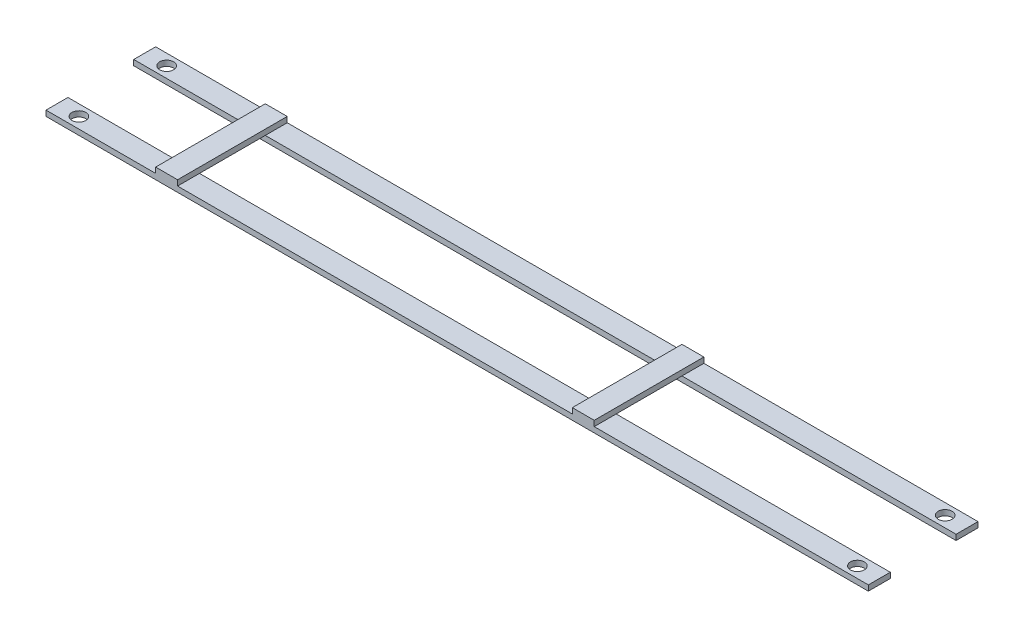
ISO-10303-21;
HEADER;
FILE_DESCRIPTION(('STEP AP214'),'2;1');
FILE_NAME('part.step','',(''),(''),'','','');
FILE_SCHEMA(('AUTOMOTIVE_DESIGN { 1 0 10303 214 1 1 1 1 }'));
ENDSEC;
DATA;
#1=APPLICATION_CONTEXT('core data for automotive mechanical design processes');
#2=APPLICATION_PROTOCOL_DEFINITION('international standard','automotive_design',2000,#1);
#3=PRODUCT_CONTEXT('',#1,'mechanical');
#4=PRODUCT('Part','Part','',(#3));
#5=PRODUCT_RELATED_PRODUCT_CATEGORY('part','',(#4));
#6=PRODUCT_DEFINITION_FORMATION('','',#4);
#7=PRODUCT_DEFINITION_CONTEXT('part definition',#1,'design');
#8=PRODUCT_DEFINITION('design','',#6,#7);
#9=PRODUCT_DEFINITION_SHAPE('','',#8);
#10=(LENGTH_UNIT() NAMED_UNIT(*) SI_UNIT(.MILLI.,.METRE.));
#11=(NAMED_UNIT(*) PLANE_ANGLE_UNIT() SI_UNIT($,.RADIAN.));
#12=(NAMED_UNIT(*) SI_UNIT($,.STERADIAN.) SOLID_ANGLE_UNIT());
#13=UNCERTAINTY_MEASURE_WITH_UNIT(LENGTH_MEASURE(1.E-05),#10,'distance_accuracy_value','');
#14=(GEOMETRIC_REPRESENTATION_CONTEXT(3) GLOBAL_UNCERTAINTY_ASSIGNED_CONTEXT((#13)) GLOBAL_UNIT_ASSIGNED_CONTEXT((#10,
#11,#12)) REPRESENTATION_CONTEXT('',''));
#15=CARTESIAN_POINT('',(0.,0.,0.));
#16=DIRECTION('',(0.,0.,1.));
#17=DIRECTION('',(1.,0.,0.));
#18=AXIS2_PLACEMENT_3D('',#15,#16,#17);
#19=CARTESIAN_POINT('',(0.,10.,0.));
#20=DIRECTION('',(0.,1.,0.));
#21=DIRECTION('',(0.,0.,1.));
#22=AXIS2_PLACEMENT_3D('',#19,#20,#21);
#23=PLANE('',#22);
#24=DIRECTION('',(-1.,0.,0.));
#25=VECTOR('',#24,1.);
#26=CARTESIAN_POINT('',(0.,10.,-120.));
#27=LINE('',#26,#25);
#28=CARTESIAN_POINT('',(240.,10.,-120.));
#29=VERTEX_POINT('',#28);
#30=CARTESIAN_POINT('',(200.,10.,-120.));
#31=VERTEX_POINT('',#30);
#32=EDGE_CURVE('E57',#29,#31,#27,.T.);
#33=ORIENTED_EDGE('',*,*,#32,.F.);
#34=DIRECTION('',(0.,0.,-1.));
#35=VECTOR('',#34,1.);
#36=CARTESIAN_POINT('',(240.,10.,40.));
#37=LINE('',#36,#35);
#38=CARTESIAN_POINT('',(240.,10.,0.));
#39=VERTEX_POINT('',#38);
#40=EDGE_CURVE('E289',#39,#29,#37,.T.);
#41=ORIENTED_EDGE('',*,*,#40,.F.);
#42=DIRECTION('',(-1.,0.,0.));
#43=VECTOR('',#42,1.);
#44=CARTESIAN_POINT('',(0.,10.,0.));
#45=LINE('',#44,#43);
#46=CARTESIAN_POINT('',(200.,10.,0.));
#47=VERTEX_POINT('',#46);
#48=EDGE_CURVE('E193',#39,#47,#45,.T.);
#49=ORIENTED_EDGE('',*,*,#48,.T.);
#50=DIRECTION('',(0.,0.,1.));
#51=VECTOR('',#50,1.);
#52=CARTESIAN_POINT('',(200.,10.,40.));
#53=LINE('',#52,#51);
#54=EDGE_CURVE('E50',#31,#47,#53,.T.);
#55=ORIENTED_EDGE('',*,*,#54,.F.);
#56=EDGE_LOOP('',(#33,#41,#49,#55));
#57=FACE_BOUND('',#56,.T.);
#58=ADVANCED_FACE('F39',(#57),#23,.F.);
#59=CARTESIAN_POINT('',(0.,10.,0.));
#60=DIRECTION('',(0.,1.,0.));
#61=DIRECTION('',(0.,0.,1.));
#62=AXIS2_PLACEMENT_3D('',#59,#60,#61);
#63=PLANE('',#62);
#64=CARTESIAN_POINT('',(1000.,10.,-120.));
#65=VERTEX_POINT('',#64);
#66=CARTESIAN_POINT('',(960.,10.,-120.));
#67=VERTEX_POINT('',#66);
#68=EDGE_CURVE('E63',#65,#67,#27,.T.);
#69=ORIENTED_EDGE('',*,*,#68,.F.);
#70=DIRECTION('',(0.,0.,-1.));
#71=VECTOR('',#70,1.);
#72=CARTESIAN_POINT('',(1000.,10.,40.));
#73=LINE('',#72,#71);
#74=CARTESIAN_POINT('',(1000.,10.,0.));
#75=VERTEX_POINT('',#74);
#76=EDGE_CURVE('E259',#75,#65,#73,.T.);
#77=ORIENTED_EDGE('',*,*,#76,.F.);
#78=CARTESIAN_POINT('',(960.,10.,0.));
#79=VERTEX_POINT('',#78);
#80=EDGE_CURVE('E186',#75,#79,#45,.T.);
#81=ORIENTED_EDGE('',*,*,#80,.T.);
#82=DIRECTION('',(0.,0.,1.));
#83=VECTOR('',#82,1.);
#84=CARTESIAN_POINT('',(960.,10.,40.));
#85=LINE('',#84,#83);
#86=EDGE_CURVE('E277',#67,#79,#85,.T.);
#87=ORIENTED_EDGE('',*,*,#86,.F.);
#88=EDGE_LOOP('',(#69,#77,#81,#87));
#89=FACE_BOUND('',#88,.T.);
#90=ADVANCED_FACE('F362',(#89),#63,.F.);
#91=CARTESIAN_POINT('',(0.,10.,0.));
#92=DIRECTION('',(0.,1.,0.));
#93=DIRECTION('',(0.,0.,1.));
#94=AXIS2_PLACEMENT_3D('',#91,#92,#93);
#95=PLANE('',#94);
#96=CARTESIAN_POINT('',(1460.,10.,20.));
#97=DIRECTION('',(0.,-1.,0.));
#98=DIRECTION('',(0.,0.,-1.));
#99=AXIS2_PLACEMENT_3D('',#96,#97,#98);
#100=CIRCLE('',#99,12.6999999999999);
#101=CARTESIAN_POINT('',(1460.,10.,7.30000000000012));
#102=VERTEX_POINT('',#101);
#103=EDGE_CURVE('E208',#102,#102,#100,.T.);
#104=ORIENTED_EDGE('',*,*,#103,.T.);
#105=EDGE_LOOP('',(#104));
#106=FACE_BOUND('',#105,.T.);
#107=CARTESIAN_POINT('',(1500.,10.,0.));
#108=VERTEX_POINT('',#107);
#109=EDGE_CURVE('E180',#108,#75,#45,.T.);
#110=ORIENTED_EDGE('',*,*,#109,.T.);
#111=CARTESIAN_POINT('',(1000.,10.,40.));
#112=VERTEX_POINT('',#111);
#113=EDGE_CURVE('E271',#112,#75,#73,.T.);
#114=ORIENTED_EDGE('',*,*,#113,.F.);
#115=DIRECTION('',(1.,0.,0.));
#116=VECTOR('',#115,1.);
#117=CARTESIAN_POINT('',(0.,10.,40.));
#118=LINE('',#117,#116);
#119=CARTESIAN_POINT('',(1500.,10.,40.));
#120=VERTEX_POINT('',#119);
#121=EDGE_CURVE('E206',#112,#120,#118,.T.);
#122=ORIENTED_EDGE('',*,*,#121,.T.);
#123=DIRECTION('',(0.,0.,1.));
#124=VECTOR('',#123,1.);
#125=CARTESIAN_POINT('',(1500.,10.,0.));
#126=LINE('',#125,#124);
#127=EDGE_CURVE('E199',#108,#120,#126,.T.);
#128=ORIENTED_EDGE('',*,*,#127,.F.);
#129=EDGE_LOOP('',(#110,#114,#122,#128));
#130=FACE_BOUND('',#129,.T.);
#131=ADVANCED_FACE('F204',(#106,#130),#95,.T.);
#132=CARTESIAN_POINT('',(240.,10.,40.));
#133=VERTEX_POINT('',#132);
#134=CARTESIAN_POINT('',(960.,10.,40.));
#135=VERTEX_POINT('',#134);
#136=EDGE_CURVE('E322',#133,#135,#118,.T.);
#137=ORIENTED_EDGE('',*,*,#136,.T.);
#138=EDGE_CURVE('E274',#79,#135,#85,.T.);
#139=ORIENTED_EDGE('',*,*,#138,.F.);
#140=EDGE_CURVE('E192',#79,#39,#45,.T.);
#141=ORIENTED_EDGE('',*,*,#140,.T.);
#142=EDGE_CURVE('E300',#133,#39,#37,.T.);
#143=ORIENTED_EDGE('',*,*,#142,.F.);
#144=EDGE_LOOP('',(#137,#139,#141,#143));
#145=FACE_BOUND('',#144,.T.);
#146=ADVANCED_FACE('F359',(#145),#95,.T.);
#147=CARTESIAN_POINT('',(0.,10.,0.));
#148=DIRECTION('',(1.,0.,0.));
#149=DIRECTION('',(0.,0.,-1.));
#150=AXIS2_PLACEMENT_3D('',#147,#148,#149);
#151=PLANE('',#150);
#152=DIRECTION('',(0.,0.,1.));
#153=VECTOR('',#152,1.);
#154=CARTESIAN_POINT('',(0.,0.,0.));
#155=LINE('',#154,#153);
#156=CARTESIAN_POINT('',(0.,0.,0.));
#157=VERTEX_POINT('',#156);
#158=CARTESIAN_POINT('',(0.,0.,40.));
#159=VERTEX_POINT('',#158);
#160=EDGE_CURVE('E315',#157,#159,#155,.T.);
#161=ORIENTED_EDGE('',*,*,#160,.T.);
#162=DIRECTION('',(0.,-1.,0.));
#163=VECTOR('',#162,1.);
#164=CARTESIAN_POINT('',(0.,10.,40.));
#165=LINE('',#164,#163);
#166=CARTESIAN_POINT('',(0.,10.,40.));
#167=VERTEX_POINT('',#166);
#168=EDGE_CURVE('E43',#167,#159,#165,.T.);
#169=ORIENTED_EDGE('',*,*,#168,.F.);
#170=DIRECTION('',(0.,0.,1.));
#171=VECTOR('',#170,1.);
#172=CARTESIAN_POINT('',(0.,10.,0.));
#173=LINE('',#172,#171);
#174=CARTESIAN_POINT('',(0.,10.,0.));
#175=VERTEX_POINT('',#174);
#176=EDGE_CURVE('E316',#175,#167,#173,.T.);
#177=ORIENTED_EDGE('',*,*,#176,.F.);
#178=DIRECTION('',(0.,-1.,0.));
#179=VECTOR('',#178,1.);
#180=CARTESIAN_POINT('',(0.,10.,0.));
#181=LINE('',#180,#179);
#182=EDGE_CURVE('E190',#175,#157,#181,.T.);
#183=ORIENTED_EDGE('',*,*,#182,.T.);
#184=EDGE_LOOP('',(#161,#169,#177,#183));
#185=FACE_BOUND('',#184,.T.);
#186=ADVANCED_FACE('F41',(#185),#151,.F.);
#187=CARTESIAN_POINT('',(0.,10.,40.));
#188=DIRECTION('',(0.,0.,-1.));
#189=DIRECTION('',(-1.,0.,0.));
#190=AXIS2_PLACEMENT_3D('',#187,#188,#189);
#191=PLANE('',#190);
#192=DIRECTION('',(1.,0.,0.));
#193=VECTOR('',#192,1.);
#194=CARTESIAN_POINT('',(0.,0.,40.));
#195=LINE('',#194,#193);
#196=CARTESIAN_POINT('',(1500.,0.,40.));
#197=VERTEX_POINT('',#196);
#198=EDGE_CURVE('E326',#159,#197,#195,.T.);
#199=ORIENTED_EDGE('',*,*,#198,.T.);
#200=DIRECTION('',(0.,1.,0.));
#201=VECTOR('',#200,1.);
#202=CARTESIAN_POINT('',(1500.,-302.654919008431,40.));
#203=LINE('',#202,#201);
#204=EDGE_CURVE('E202',#197,#120,#203,.T.);
#205=ORIENTED_EDGE('',*,*,#204,.T.);
#206=ORIENTED_EDGE('',*,*,#121,.F.);
#207=DIRECTION('',(0.,-1.,0.));
#208=VECTOR('',#207,1.);
#209=CARTESIAN_POINT('',(1000.,20.,40.));
#210=LINE('',#209,#208);
#211=CARTESIAN_POINT('',(1000.,20.,40.));
#212=VERTEX_POINT('',#211);
#213=EDGE_CURVE('E270',#212,#112,#210,.T.);
#214=ORIENTED_EDGE('',*,*,#213,.F.);
#215=DIRECTION('',(1.,0.,0.));
#216=VECTOR('',#215,1.);
#217=CARTESIAN_POINT('',(1000.,20.,40.));
#218=LINE('',#217,#216);
#219=CARTESIAN_POINT('',(960.,20.,40.));
#220=VERTEX_POINT('',#219);
#221=EDGE_CURVE('E268',#220,#212,#218,.T.);
#222=ORIENTED_EDGE('',*,*,#221,.F.);
#223=DIRECTION('',(0.,-1.,0.));
#224=VECTOR('',#223,1.);
#225=CARTESIAN_POINT('',(960.,20.,40.));
#226=LINE('',#225,#224);
#227=EDGE_CURVE('E280',#220,#135,#226,.T.);
#228=ORIENTED_EDGE('',*,*,#227,.T.);
#229=ORIENTED_EDGE('',*,*,#136,.F.);
#230=DIRECTION('',(0.,-1.,0.));
#231=VECTOR('',#230,1.);
#232=CARTESIAN_POINT('',(240.,20.,40.));
#233=LINE('',#232,#231);
#234=CARTESIAN_POINT('',(240.,20.,40.));
#235=VERTEX_POINT('',#234);
#236=EDGE_CURVE('E299',#235,#133,#233,.T.);
#237=ORIENTED_EDGE('',*,*,#236,.F.);
#238=DIRECTION('',(1.,0.,0.));
#239=VECTOR('',#238,1.);
#240=CARTESIAN_POINT('',(240.,20.,40.));
#241=LINE('',#240,#239);
#242=CARTESIAN_POINT('',(200.,20.,40.));
#243=VERTEX_POINT('',#242);
#244=EDGE_CURVE('E297',#243,#235,#241,.T.);
#245=ORIENTED_EDGE('',*,*,#244,.F.);
#246=DIRECTION('',(0.,-1.,0.));
#247=VECTOR('',#246,1.);
#248=CARTESIAN_POINT('',(200.,20.,40.));
#249=LINE('',#248,#247);
#250=CARTESIAN_POINT('',(200.,10.,40.));
#251=VERTEX_POINT('',#250);
#252=EDGE_CURVE('E306',#243,#251,#249,.T.);
#253=ORIENTED_EDGE('',*,*,#252,.T.);
#254=EDGE_CURVE('E320',#167,#251,#118,.T.);
#255=ORIENTED_EDGE('',*,*,#254,.F.);
#256=ORIENTED_EDGE('',*,*,#168,.T.);
#257=EDGE_LOOP('',(#199,#205,#206,#214,#222,#228,#229,#237,#245,#253,#255,#256));
#258=FACE_BOUND('',#257,.T.);
#259=ADVANCED_FACE('F336',(#258),#191,.F.);
#260=CARTESIAN_POINT('',(0.,10.,0.));
#261=DIRECTION('',(0.,0.,1.));
#262=DIRECTION('',(1.,0.,0.));
#263=AXIS2_PLACEMENT_3D('',#260,#261,#262);
#264=PLANE('',#263);
#265=DIRECTION('',(-1.,0.,0.));
#266=VECTOR('',#265,1.);
#267=CARTESIAN_POINT('',(0.,0.,0.));
#268=LINE('',#267,#266);
#269=CARTESIAN_POINT('',(1500.,0.,0.));
#270=VERTEX_POINT('',#269);
#271=EDGE_CURVE('E319',#270,#157,#268,.T.);
#272=ORIENTED_EDGE('',*,*,#271,.T.);
#273=ORIENTED_EDGE('',*,*,#182,.F.);
#274=EDGE_CURVE('E321',#47,#175,#45,.T.);
#275=ORIENTED_EDGE('',*,*,#274,.F.);
#276=ORIENTED_EDGE('',*,*,#48,.F.);
#277=ORIENTED_EDGE('',*,*,#140,.F.);
#278=ORIENTED_EDGE('',*,*,#80,.F.);
#279=ORIENTED_EDGE('',*,*,#109,.F.);
#280=DIRECTION('',(0.,1.,0.));
#281=VECTOR('',#280,1.);
#282=CARTESIAN_POINT('',(1500.,-302.654919008431,0.));
#283=LINE('',#282,#281);
#284=EDGE_CURVE('E183',#270,#108,#283,.T.);
#285=ORIENTED_EDGE('',*,*,#284,.F.);
#286=EDGE_LOOP('',(#272,#273,#275,#276,#277,#278,#279,#285));
#287=FACE_BOUND('',#286,.T.);
#288=ADVANCED_FACE('F182',(#287),#264,.F.);
#289=CARTESIAN_POINT('',(40.,10.,20.));
#290=DIRECTION('',(0.,-1.,0.));
#291=DIRECTION('',(0.,0.,-1.));
#292=AXIS2_PLACEMENT_3D('',#289,#290,#291);
#293=CIRCLE('',#292,12.7);
#294=CARTESIAN_POINT('',(40.,10.,7.3));
#295=VERTEX_POINT('',#294);
#296=EDGE_CURVE('E456',#295,#295,#293,.T.);
#297=ORIENTED_EDGE('',*,*,#296,.T.);
#298=EDGE_LOOP('',(#297));
#299=FACE_BOUND('',#298,.T.);
#300=EDGE_CURVE('E11',#47,#251,#53,.T.);
#301=ORIENTED_EDGE('',*,*,#300,.F.);
#302=ORIENTED_EDGE('',*,*,#274,.T.);
#303=ORIENTED_EDGE('',*,*,#176,.T.);
#304=ORIENTED_EDGE('',*,*,#254,.T.);
#305=EDGE_LOOP('',(#301,#302,#303,#304));
#306=FACE_BOUND('',#305,.T.);
#307=ADVANCED_FACE('F371',(#299,#306),#95,.T.);
#308=CARTESIAN_POINT('',(0.,0.,0.));
#309=DIRECTION('',(0.,1.,0.));
#310=DIRECTION('',(0.,0.,1.));
#311=AXIS2_PLACEMENT_3D('',#308,#309,#310);
#312=PLANE('',#311);
#313=CARTESIAN_POINT('',(40.,0.,20.));
#314=DIRECTION('',(0.,-1.,0.));
#315=DIRECTION('',(0.,0.,-1.));
#316=AXIS2_PLACEMENT_3D('',#313,#314,#315);
#317=CIRCLE('',#316,12.7);
#318=CARTESIAN_POINT('',(40.,0.,7.3));
#319=VERTEX_POINT('',#318);
#320=EDGE_CURVE('E458',#319,#319,#317,.T.);
#321=ORIENTED_EDGE('',*,*,#320,.F.);
#322=EDGE_LOOP('',(#321));
#323=FACE_BOUND('',#322,.T.);
#324=CARTESIAN_POINT('',(1460.,0.,20.));
#325=DIRECTION('',(0.,-1.,0.));
#326=DIRECTION('',(0.,0.,-1.));
#327=AXIS2_PLACEMENT_3D('',#324,#325,#326);
#328=CIRCLE('',#327,12.6999999999999);
#329=CARTESIAN_POINT('',(1460.,0.,7.30000000000012));
#330=VERTEX_POINT('',#329);
#331=EDGE_CURVE('E211',#330,#330,#328,.T.);
#332=ORIENTED_EDGE('',*,*,#331,.F.);
#333=EDGE_LOOP('',(#332));
#334=FACE_BOUND('',#333,.T.);
#335=ORIENTED_EDGE('',*,*,#160,.F.);
#336=ORIENTED_EDGE('',*,*,#271,.F.);
#337=DIRECTION('',(0.,0.,-1.));
#338=VECTOR('',#337,1.);
#339=CARTESIAN_POINT('',(1500.,0.,0.));
#340=LINE('',#339,#338);
#341=EDGE_CURVE('E201',#197,#270,#340,.T.);
#342=ORIENTED_EDGE('',*,*,#341,.F.);
#343=ORIENTED_EDGE('',*,*,#198,.F.);
#344=EDGE_LOOP('',(#335,#336,#342,#343));
#345=FACE_BOUND('',#344,.T.);
#346=ADVANCED_FACE('F338',(#323,#334,#345),#312,.F.);
#347=CARTESIAN_POINT('',(240.,20.,40.));
#348=DIRECTION('',(-1.,0.,0.));
#349=DIRECTION('',(0.,0.,1.));
#350=AXIS2_PLACEMENT_3D('',#347,#348,#349);
#351=PLANE('',#350);
#352=ORIENTED_EDGE('',*,*,#142,.T.);
#353=ORIENTED_EDGE('',*,*,#40,.T.);
#354=DIRECTION('',(0.,0.,-1.));
#355=VECTOR('',#354,1.);
#356=CARTESIAN_POINT('',(240.,10.,40.));
#357=LINE('',#356,#355);
#358=CARTESIAN_POINT('',(240.,10.,-160.));
#359=VERTEX_POINT('',#358);
#360=EDGE_CURVE('E256',#29,#359,#357,.T.);
#361=ORIENTED_EDGE('',*,*,#360,.T.);
#362=DIRECTION('',(0.,-1.,0.));
#363=VECTOR('',#362,1.);
#364=CARTESIAN_POINT('',(240.,20.,-160.));
#365=LINE('',#364,#363);
#366=CARTESIAN_POINT('',(240.,20.,-160.));
#367=VERTEX_POINT('',#366);
#368=EDGE_CURVE('E312',#367,#359,#365,.T.);
#369=ORIENTED_EDGE('',*,*,#368,.F.);
#370=DIRECTION('',(0.,0.,-1.));
#371=VECTOR('',#370,1.);
#372=CARTESIAN_POINT('',(240.,20.,40.));
#373=LINE('',#372,#371);
#374=EDGE_CURVE('E290',#235,#367,#373,.T.);
#375=ORIENTED_EDGE('',*,*,#374,.F.);
#376=ORIENTED_EDGE('',*,*,#236,.T.);
#377=EDGE_LOOP('',(#352,#353,#361,#369,#375,#376));
#378=FACE_BOUND('',#377,.T.);
#379=ADVANCED_FACE('F393',(#378),#351,.F.);
#380=CARTESIAN_POINT('',(240.,20.,-160.));
#381=DIRECTION('',(0.,0.,1.));
#382=DIRECTION('',(1.,0.,0.));
#383=AXIS2_PLACEMENT_3D('',#380,#381,#382);
#384=PLANE('',#383);
#385=ORIENTED_EDGE('',*,*,#368,.T.);
#386=DIRECTION('',(1.,0.,0.));
#387=VECTOR('',#386,1.);
#388=CARTESIAN_POINT('',(0.,10.,-160.));
#389=LINE('',#388,#387);
#390=CARTESIAN_POINT('',(960.,10.,-160.));
#391=VERTEX_POINT('',#390);
#392=EDGE_CURVE('E246',#359,#391,#389,.T.);
#393=ORIENTED_EDGE('',*,*,#392,.T.);
#394=DIRECTION('',(0.,-1.,0.));
#395=VECTOR('',#394,1.);
#396=CARTESIAN_POINT('',(960.,20.,-160.));
#397=LINE('',#396,#395);
#398=CARTESIAN_POINT('',(960.,20.,-160.));
#399=VERTEX_POINT('',#398);
#400=EDGE_CURVE('E283',#399,#391,#397,.T.);
#401=ORIENTED_EDGE('',*,*,#400,.F.);
#402=DIRECTION('',(-1.,0.,0.));
#403=VECTOR('',#402,1.);
#404=CARTESIAN_POINT('',(1000.,20.,-160.));
#405=LINE('',#404,#403);
#406=CARTESIAN_POINT('',(1000.,20.,-160.));
#407=VERTEX_POINT('',#406);
#408=EDGE_CURVE('E263',#407,#399,#405,.T.);
#409=ORIENTED_EDGE('',*,*,#408,.F.);
#410=DIRECTION('',(0.,-1.,0.));
#411=VECTOR('',#410,1.);
#412=CARTESIAN_POINT('',(1000.,20.,-160.));
#413=LINE('',#412,#411);
#414=CARTESIAN_POINT('',(1000.,10.,-160.));
#415=VERTEX_POINT('',#414);
#416=EDGE_CURVE('E286',#407,#415,#413,.T.);
#417=ORIENTED_EDGE('',*,*,#416,.T.);
#418=CARTESIAN_POINT('',(1500.,10.,-160.));
#419=VERTEX_POINT('',#418);
#420=EDGE_CURVE('E241',#415,#419,#389,.T.);
#421=ORIENTED_EDGE('',*,*,#420,.T.);
#422=DIRECTION('',(0.,1.,0.));
#423=VECTOR('',#422,1.);
#424=CARTESIAN_POINT('',(1500.,-302.654919008431,-160.));
#425=LINE('',#424,#423);
#426=CARTESIAN_POINT('',(1500.,0.,-160.));
#427=VERTEX_POINT('',#426);
#428=EDGE_CURVE('E225',#427,#419,#425,.T.);
#429=ORIENTED_EDGE('',*,*,#428,.F.);
#430=DIRECTION('',(1.,0.,0.));
#431=VECTOR('',#430,1.);
#432=CARTESIAN_POINT('',(0.,0.,-160.));
#433=LINE('',#432,#431);
#434=CARTESIAN_POINT('',(0.,0.,-160.));
#435=VERTEX_POINT('',#434);
#436=EDGE_CURVE('E233',#435,#427,#433,.T.);
#437=ORIENTED_EDGE('',*,*,#436,.F.);
#438=DIRECTION('',(0.,1.,0.));
#439=VECTOR('',#438,1.);
#440=CARTESIAN_POINT('',(0.,0.,-160.));
#441=LINE('',#440,#439);
#442=CARTESIAN_POINT('',(0.,10.,-160.));
#443=VERTEX_POINT('',#442);
#444=EDGE_CURVE('E250',#435,#443,#441,.T.);
#445=ORIENTED_EDGE('',*,*,#444,.T.);
#446=CARTESIAN_POINT('',(200.,10.,-160.));
#447=VERTEX_POINT('',#446);
#448=EDGE_CURVE('E242',#443,#447,#389,.T.);
#449=ORIENTED_EDGE('',*,*,#448,.T.);
#450=DIRECTION('',(0.,-1.,0.));
#451=VECTOR('',#450,1.);
#452=CARTESIAN_POINT('',(200.,20.,-160.));
#453=LINE('',#452,#451);
#454=CARTESIAN_POINT('',(200.,20.,-160.));
#455=VERTEX_POINT('',#454);
#456=EDGE_CURVE('E309',#455,#447,#453,.T.);
#457=ORIENTED_EDGE('',*,*,#456,.F.);
#458=DIRECTION('',(-1.,0.,0.));
#459=VECTOR('',#458,1.);
#460=CARTESIAN_POINT('',(240.,20.,-160.));
#461=LINE('',#460,#459);
#462=EDGE_CURVE('E293',#367,#455,#461,.T.);
#463=ORIENTED_EDGE('',*,*,#462,.F.);
#464=EDGE_LOOP('',(#385,#393,#401,#409,#417,#421,#429,#437,#445,#449,#457,#463));
#465=FACE_BOUND('',#464,.T.);
#466=ADVANCED_FACE('F383',(#465),#384,.F.);
#467=CARTESIAN_POINT('',(200.,20.,40.));
#468=DIRECTION('',(1.,0.,0.));
#469=DIRECTION('',(0.,0.,-1.));
#470=AXIS2_PLACEMENT_3D('',#467,#468,#469);
#471=PLANE('',#470);
#472=EDGE_CURVE('E49',#447,#31,#53,.T.);
#473=ORIENTED_EDGE('',*,*,#472,.T.);
#474=ORIENTED_EDGE('',*,*,#54,.T.);
#475=ORIENTED_EDGE('',*,*,#300,.T.);
#476=ORIENTED_EDGE('',*,*,#252,.F.);
#477=DIRECTION('',(0.,0.,1.));
#478=VECTOR('',#477,1.);
#479=CARTESIAN_POINT('',(200.,20.,40.));
#480=LINE('',#479,#478);
#481=EDGE_CURVE('E295',#455,#243,#480,.T.);
#482=ORIENTED_EDGE('',*,*,#481,.F.);
#483=ORIENTED_EDGE('',*,*,#456,.T.);
#484=EDGE_LOOP('',(#473,#474,#475,#476,#482,#483));
#485=FACE_BOUND('',#484,.T.);
#486=ADVANCED_FACE('F374',(#485),#471,.F.);
#487=CARTESIAN_POINT('',(0.,20.,0.));
#488=DIRECTION('',(0.,1.,0.));
#489=DIRECTION('',(0.,0.,1.));
#490=AXIS2_PLACEMENT_3D('',#487,#488,#489);
#491=PLANE('',#490);
#492=ORIENTED_EDGE('',*,*,#374,.T.);
#493=ORIENTED_EDGE('',*,*,#462,.T.);
#494=ORIENTED_EDGE('',*,*,#481,.T.);
#495=ORIENTED_EDGE('',*,*,#244,.T.);
#496=EDGE_LOOP('',(#492,#493,#494,#495));
#497=FACE_BOUND('',#496,.T.);
#498=ADVANCED_FACE('F379',(#497),#491,.T.);
#499=CARTESIAN_POINT('',(1000.,20.,40.));
#500=DIRECTION('',(-1.,0.,0.));
#501=DIRECTION('',(0.,0.,1.));
#502=AXIS2_PLACEMENT_3D('',#499,#500,#501);
#503=PLANE('',#502);
#504=ORIENTED_EDGE('',*,*,#113,.T.);
#505=ORIENTED_EDGE('',*,*,#76,.T.);
#506=DIRECTION('',(0.,0.,-1.));
#507=VECTOR('',#506,1.);
#508=CARTESIAN_POINT('',(1000.,10.,40.));
#509=LINE('',#508,#507);
#510=EDGE_CURVE('E253',#65,#415,#509,.T.);
#511=ORIENTED_EDGE('',*,*,#510,.T.);
#512=ORIENTED_EDGE('',*,*,#416,.F.);
#513=DIRECTION('',(0.,0.,-1.));
#514=VECTOR('',#513,1.);
#515=CARTESIAN_POINT('',(1000.,20.,40.));
#516=LINE('',#515,#514);
#517=EDGE_CURVE('E260',#212,#407,#516,.T.);
#518=ORIENTED_EDGE('',*,*,#517,.F.);
#519=ORIENTED_EDGE('',*,*,#213,.T.);
#520=EDGE_LOOP('',(#504,#505,#511,#512,#518,#519));
#521=FACE_BOUND('',#520,.T.);
#522=ADVANCED_FACE('F343',(#521),#503,.F.);
#523=CARTESIAN_POINT('',(960.,20.,40.));
#524=DIRECTION('',(1.,0.,0.));
#525=DIRECTION('',(0.,0.,-1.));
#526=AXIS2_PLACEMENT_3D('',#523,#524,#525);
#527=PLANE('',#526);
#528=EDGE_CURVE('E264',#391,#67,#85,.T.);
#529=ORIENTED_EDGE('',*,*,#528,.T.);
#530=ORIENTED_EDGE('',*,*,#86,.T.);
#531=ORIENTED_EDGE('',*,*,#138,.T.);
#532=ORIENTED_EDGE('',*,*,#227,.F.);
#533=DIRECTION('',(0.,0.,1.));
#534=VECTOR('',#533,1.);
#535=CARTESIAN_POINT('',(960.,20.,40.));
#536=LINE('',#535,#534);
#537=EDGE_CURVE('E266',#399,#220,#536,.T.);
#538=ORIENTED_EDGE('',*,*,#537,.F.);
#539=ORIENTED_EDGE('',*,*,#400,.T.);
#540=EDGE_LOOP('',(#529,#530,#531,#532,#538,#539));
#541=FACE_BOUND('',#540,.T.);
#542=ADVANCED_FACE('F355',(#541),#527,.F.);
#543=CARTESIAN_POINT('',(0.,20.,0.));
#544=DIRECTION('',(0.,1.,0.));
#545=DIRECTION('',(0.,0.,1.));
#546=AXIS2_PLACEMENT_3D('',#543,#544,#545);
#547=PLANE('',#546);
#548=ORIENTED_EDGE('',*,*,#517,.T.);
#549=ORIENTED_EDGE('',*,*,#408,.T.);
#550=ORIENTED_EDGE('',*,*,#537,.T.);
#551=ORIENTED_EDGE('',*,*,#221,.T.);
#552=EDGE_LOOP('',(#548,#549,#550,#551));
#553=FACE_BOUND('',#552,.T.);
#554=ADVANCED_FACE('F347',(#553),#547,.T.);
#555=CARTESIAN_POINT('',(0.,10.,0.));
#556=DIRECTION('',(0.,1.,0.));
#557=DIRECTION('',(0.,0.,1.));
#558=AXIS2_PLACEMENT_3D('',#555,#556,#557);
#559=PLANE('',#558);
#560=ORIENTED_EDGE('',*,*,#360,.F.);
#561=EDGE_CURVE('E389',#67,#29,#27,.T.);
#562=ORIENTED_EDGE('',*,*,#561,.F.);
#563=ORIENTED_EDGE('',*,*,#528,.F.);
#564=ORIENTED_EDGE('',*,*,#392,.F.);
#565=EDGE_LOOP('',(#560,#562,#563,#564));
#566=FACE_BOUND('',#565,.T.);
#567=ADVANCED_FACE('F395',(#566),#559,.T.);
#568=CARTESIAN_POINT('',(40.,10.,-140.));
#569=DIRECTION('',(0.,-1.,0.));
#570=DIRECTION('',(0.,0.,-1.));
#571=AXIS2_PLACEMENT_3D('',#568,#569,#570);
#572=CIRCLE('',#571,12.7);
#573=CARTESIAN_POINT('',(40.,10.,-152.7));
#574=VERTEX_POINT('',#573);
#575=EDGE_CURVE('E470',#574,#574,#572,.T.);
#576=ORIENTED_EDGE('',*,*,#575,.T.);
#577=EDGE_LOOP('',(#576));
#578=FACE_BOUND('',#577,.T.);
#579=ORIENTED_EDGE('',*,*,#472,.F.);
#580=ORIENTED_EDGE('',*,*,#448,.F.);
#581=DIRECTION('',(0.,0.,-1.));
#582=VECTOR('',#581,1.);
#583=CARTESIAN_POINT('',(0.,10.,-160.));
#584=LINE('',#583,#582);
#585=CARTESIAN_POINT('',(0.,10.,-120.));
#586=VERTEX_POINT('',#585);
#587=EDGE_CURVE('E220',#586,#443,#584,.T.);
#588=ORIENTED_EDGE('',*,*,#587,.F.);
#589=EDGE_CURVE('E245',#31,#586,#27,.T.);
#590=ORIENTED_EDGE('',*,*,#589,.F.);
#591=EDGE_LOOP('',(#579,#580,#588,#590));
#592=FACE_BOUND('',#591,.T.);
#593=ADVANCED_FACE('F387',(#578,#592),#559,.T.);
#594=CARTESIAN_POINT('',(1460.,10.,-140.));
#595=DIRECTION('',(0.,-1.,0.));
#596=DIRECTION('',(0.,0.,-1.));
#597=AXIS2_PLACEMENT_3D('',#594,#595,#596);
#598=CIRCLE('',#597,12.6999999999999);
#599=CARTESIAN_POINT('',(1460.,10.,-152.7));
#600=VERTEX_POINT('',#599);
#601=EDGE_CURVE('E464',#600,#600,#598,.T.);
#602=ORIENTED_EDGE('',*,*,#601,.T.);
#603=EDGE_LOOP('',(#602));
#604=FACE_BOUND('',#603,.T.);
#605=ORIENTED_EDGE('',*,*,#510,.F.);
#606=CARTESIAN_POINT('',(1500.,10.,-120.));
#607=VERTEX_POINT('',#606);
#608=EDGE_CURVE('E234',#607,#65,#27,.T.);
#609=ORIENTED_EDGE('',*,*,#608,.F.);
#610=DIRECTION('',(0.,0.,1.));
#611=VECTOR('',#610,1.);
#612=CARTESIAN_POINT('',(1500.,10.,0.));
#613=LINE('',#612,#611);
#614=EDGE_CURVE('E222',#419,#607,#613,.T.);
#615=ORIENTED_EDGE('',*,*,#614,.F.);
#616=ORIENTED_EDGE('',*,*,#420,.F.);
#617=EDGE_LOOP('',(#605,#609,#615,#616));
#618=FACE_BOUND('',#617,.T.);
#619=ADVANCED_FACE('F398',(#604,#618),#559,.T.);
#620=CARTESIAN_POINT('',(0.,0.,-160.));
#621=DIRECTION('',(1.,0.,0.));
#622=DIRECTION('',(0.,0.,-1.));
#623=AXIS2_PLACEMENT_3D('',#620,#621,#622);
#624=PLANE('',#623);
#625=ORIENTED_EDGE('',*,*,#587,.T.);
#626=ORIENTED_EDGE('',*,*,#444,.F.);
#627=DIRECTION('',(0.,0.,-1.));
#628=VECTOR('',#627,1.);
#629=CARTESIAN_POINT('',(0.,0.,-160.));
#630=LINE('',#629,#628);
#631=CARTESIAN_POINT('',(0.,0.,-120.));
#632=VERTEX_POINT('',#631);
#633=EDGE_CURVE('E230',#632,#435,#630,.T.);
#634=ORIENTED_EDGE('',*,*,#633,.F.);
#635=DIRECTION('',(0.,1.,0.));
#636=VECTOR('',#635,1.);
#637=CARTESIAN_POINT('',(0.,0.,-120.));
#638=LINE('',#637,#636);
#639=EDGE_CURVE('E238',#632,#586,#638,.T.);
#640=ORIENTED_EDGE('',*,*,#639,.T.);
#641=EDGE_LOOP('',(#625,#626,#634,#640));
#642=FACE_BOUND('',#641,.T.);
#643=ADVANCED_FACE('F408',(#642),#624,.F.);
#644=CARTESIAN_POINT('',(0.,0.,-120.));
#645=DIRECTION('',(0.,0.,-1.));
#646=DIRECTION('',(-1.,0.,0.));
#647=AXIS2_PLACEMENT_3D('',#644,#645,#646);
#648=PLANE('',#647);
#649=ORIENTED_EDGE('',*,*,#608,.T.);
#650=ORIENTED_EDGE('',*,*,#68,.T.);
#651=ORIENTED_EDGE('',*,*,#561,.T.);
#652=ORIENTED_EDGE('',*,*,#32,.T.);
#653=ORIENTED_EDGE('',*,*,#589,.T.);
#654=ORIENTED_EDGE('',*,*,#639,.F.);
#655=DIRECTION('',(-1.,0.,0.));
#656=VECTOR('',#655,1.);
#657=CARTESIAN_POINT('',(0.,0.,-120.));
#658=LINE('',#657,#656);
#659=CARTESIAN_POINT('',(1500.,0.,-120.));
#660=VERTEX_POINT('',#659);
#661=EDGE_CURVE('E236',#660,#632,#658,.T.);
#662=ORIENTED_EDGE('',*,*,#661,.F.);
#663=DIRECTION('',(0.,1.,0.));
#664=VECTOR('',#663,1.);
#665=CARTESIAN_POINT('',(1500.,-302.654919008431,-120.));
#666=LINE('',#665,#664);
#667=EDGE_CURVE('E221',#660,#607,#666,.T.);
#668=ORIENTED_EDGE('',*,*,#667,.T.);
#669=EDGE_LOOP('',(#649,#650,#651,#652,#653,#654,#662,#668));
#670=FACE_BOUND('',#669,.T.);
#671=ADVANCED_FACE('F390',(#670),#648,.F.);
#672=CARTESIAN_POINT('',(0.,0.,0.));
#673=DIRECTION('',(0.,1.,0.));
#674=DIRECTION('',(0.,0.,1.));
#675=AXIS2_PLACEMENT_3D('',#672,#673,#674);
#676=PLANE('',#675);
#677=CARTESIAN_POINT('',(1460.,0.,-140.));
#678=DIRECTION('',(0.,-1.,0.));
#679=DIRECTION('',(0.,0.,-1.));
#680=AXIS2_PLACEMENT_3D('',#677,#678,#679);
#681=CIRCLE('',#680,12.6999999999999);
#682=CARTESIAN_POINT('',(1460.,0.,-152.7));
#683=VERTEX_POINT('',#682);
#684=EDGE_CURVE('E461',#683,#683,#681,.T.);
#685=ORIENTED_EDGE('',*,*,#684,.F.);
#686=EDGE_LOOP('',(#685));
#687=FACE_BOUND('',#686,.T.);
#688=CARTESIAN_POINT('',(40.,0.,-140.));
#689=DIRECTION('',(0.,-1.,0.));
#690=DIRECTION('',(0.,0.,-1.));
#691=AXIS2_PLACEMENT_3D('',#688,#689,#690);
#692=CIRCLE('',#691,12.7);
#693=CARTESIAN_POINT('',(40.,0.,-152.7));
#694=VERTEX_POINT('',#693);
#695=EDGE_CURVE('E467',#694,#694,#692,.T.);
#696=ORIENTED_EDGE('',*,*,#695,.F.);
#697=EDGE_LOOP('',(#696));
#698=FACE_BOUND('',#697,.T.);
#699=ORIENTED_EDGE('',*,*,#633,.T.);
#700=ORIENTED_EDGE('',*,*,#436,.T.);
#701=DIRECTION('',(0.,0.,-1.));
#702=VECTOR('',#701,1.);
#703=CARTESIAN_POINT('',(1500.,0.,0.));
#704=LINE('',#703,#702);
#705=EDGE_CURVE('E217',#660,#427,#704,.T.);
#706=ORIENTED_EDGE('',*,*,#705,.F.);
#707=ORIENTED_EDGE('',*,*,#661,.T.);
#708=EDGE_LOOP('',(#699,#700,#706,#707));
#709=FACE_BOUND('',#708,.T.);
#710=ADVANCED_FACE('F494',(#687,#698,#709),#676,.F.);
#711=CARTESIAN_POINT('',(1500.,-302.654919008431,0.));
#712=DIRECTION('',(-1.,0.,0.));
#713=DIRECTION('',(0.,0.,1.));
#714=AXIS2_PLACEMENT_3D('',#711,#712,#713);
#715=PLANE('',#714);
#716=ORIENTED_EDGE('',*,*,#667,.F.);
#717=ORIENTED_EDGE('',*,*,#705,.T.);
#718=ORIENTED_EDGE('',*,*,#428,.T.);
#719=ORIENTED_EDGE('',*,*,#614,.T.);
#720=EDGE_LOOP('',(#716,#717,#718,#719));
#721=FACE_BOUND('',#720,.T.);
#722=ADVANCED_FACE('F492',(#721),#715,.F.);
#723=CARTESIAN_POINT('',(1500.,-302.654919008431,0.));
#724=DIRECTION('',(-1.,0.,0.));
#725=DIRECTION('',(0.,0.,1.));
#726=AXIS2_PLACEMENT_3D('',#723,#724,#725);
#727=PLANE('',#726);
#728=ORIENTED_EDGE('',*,*,#204,.F.);
#729=ORIENTED_EDGE('',*,*,#341,.T.);
#730=ORIENTED_EDGE('',*,*,#284,.T.);
#731=ORIENTED_EDGE('',*,*,#127,.T.);
#732=EDGE_LOOP('',(#728,#729,#730,#731));
#733=FACE_BOUND('',#732,.T.);
#734=ADVANCED_FACE('F198',(#733),#727,.F.);
#735=CARTESIAN_POINT('',(40.,10.,-140.));
#736=DIRECTION('',(0.,-1.,0.));
#737=DIRECTION('',(0.,0.,-1.));
#738=AXIS2_PLACEMENT_3D('',#735,#736,#737);
#739=CYLINDRICAL_SURFACE('',#738,12.7);
#740=ORIENTED_EDGE('',*,*,#575,.F.);
#741=EDGE_LOOP('',(#740));
#742=FACE_BOUND('',#741,.T.);
#743=ORIENTED_EDGE('',*,*,#695,.T.);
#744=EDGE_LOOP('',(#743));
#745=FACE_BOUND('',#744,.T.);
#746=ADVANCED_FACE('F483',(#742,#745),#739,.F.);
#747=CARTESIAN_POINT('',(1460.,10.,-140.));
#748=DIRECTION('',(0.,-1.,0.));
#749=DIRECTION('',(0.,0.,-1.));
#750=AXIS2_PLACEMENT_3D('',#747,#748,#749);
#751=CYLINDRICAL_SURFACE('',#750,12.6999999999999);
#752=ORIENTED_EDGE('',*,*,#601,.F.);
#753=EDGE_LOOP('',(#752));
#754=FACE_BOUND('',#753,.T.);
#755=ORIENTED_EDGE('',*,*,#684,.T.);
#756=EDGE_LOOP('',(#755));
#757=FACE_BOUND('',#756,.T.);
#758=ADVANCED_FACE('F451',(#754,#757),#751,.F.);
#759=CARTESIAN_POINT('',(1460.,10.,20.));
#760=DIRECTION('',(0.,-1.,0.));
#761=DIRECTION('',(0.,0.,-1.));
#762=AXIS2_PLACEMENT_3D('',#759,#760,#761);
#763=CYLINDRICAL_SURFACE('',#762,12.6999999999999);
#764=ORIENTED_EDGE('',*,*,#103,.F.);
#765=EDGE_LOOP('',(#764));
#766=FACE_BOUND('',#765,.T.);
#767=ORIENTED_EDGE('',*,*,#331,.T.);
#768=EDGE_LOOP('',(#767));
#769=FACE_BOUND('',#768,.T.);
#770=ADVANCED_FACE('F447',(#766,#769),#763,.F.);
#771=CARTESIAN_POINT('',(40.,10.,20.));
#772=DIRECTION('',(0.,-1.,0.));
#773=DIRECTION('',(0.,0.,-1.));
#774=AXIS2_PLACEMENT_3D('',#771,#772,#773);
#775=CYLINDRICAL_SURFACE('',#774,12.7);
#776=ORIENTED_EDGE('',*,*,#296,.F.);
#777=EDGE_LOOP('',(#776));
#778=FACE_BOUND('',#777,.T.);
#779=ORIENTED_EDGE('',*,*,#320,.T.);
#780=EDGE_LOOP('',(#779));
#781=FACE_BOUND('',#780,.T.);
#782=ADVANCED_FACE('F450',(#778,#781),#775,.F.);
#783=CLOSED_SHELL('',(#58,#90,#131,#146,#186,#259,#288,#307,#346,#379,#466,#486,#498,#522,#542,
#554,#567,#593,#619,#643,#671,#710,#722,#734,#746,#758,#770,#782));
#784=MANIFOLD_SOLID_BREP('B2',#783);
#785=ADVANCED_BREP_SHAPE_REPRESENTATION('',(#18,#784),#14);
#786=SHAPE_DEFINITION_REPRESENTATION(#9,#785);
ENDSEC;
END-ISO-10303-21;
